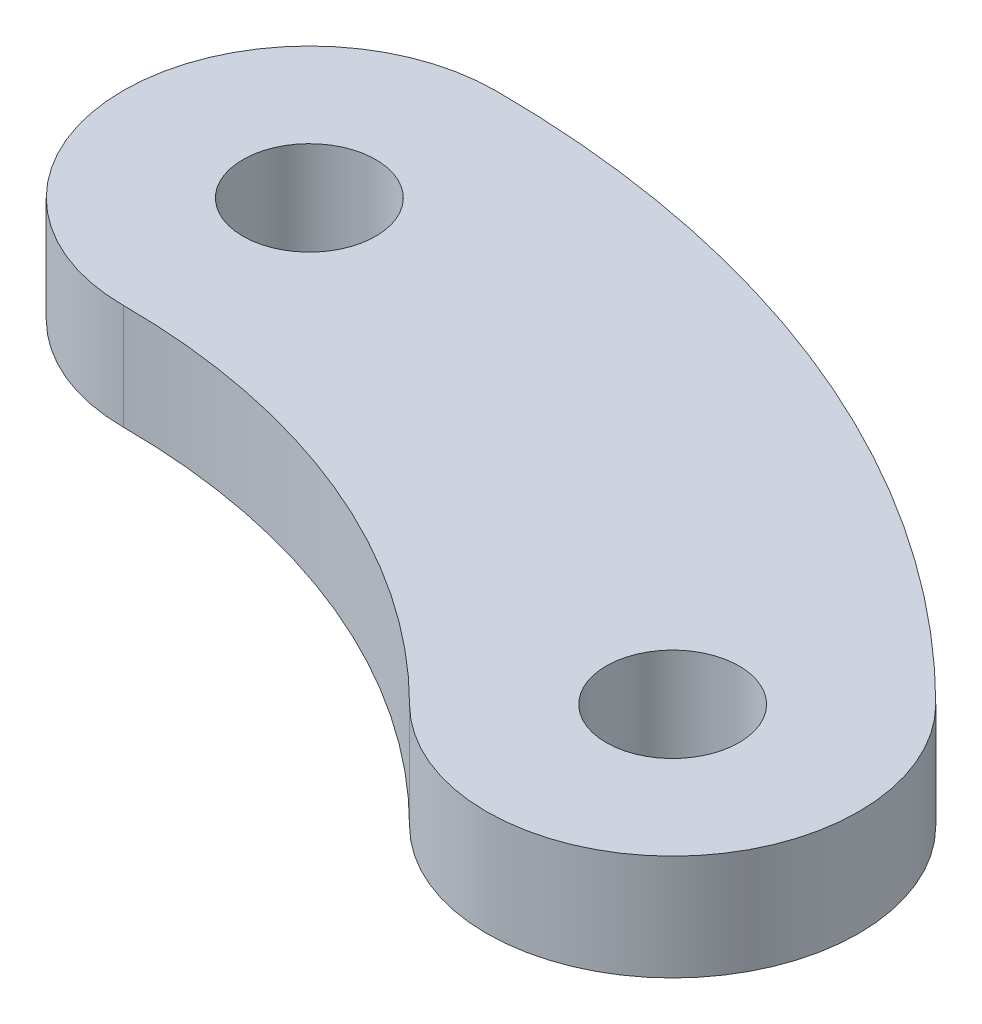
ISO-10303-21;
HEADER;
FILE_DESCRIPTION(('STEP AP214'),'2;1');
FILE_NAME('part.step','',(''),(''),'','','');
FILE_SCHEMA(('AUTOMOTIVE_DESIGN { 1 0 10303 214 1 1 1 1 }'));
ENDSEC;
DATA;
#1=APPLICATION_CONTEXT('core data for automotive mechanical design processes');
#2=APPLICATION_PROTOCOL_DEFINITION('international standard','automotive_design',2000,#1);
#3=PRODUCT_CONTEXT('',#1,'mechanical');
#4=PRODUCT('Part','Part','',(#3));
#5=PRODUCT_RELATED_PRODUCT_CATEGORY('part','',(#4));
#6=PRODUCT_DEFINITION_FORMATION('','',#4);
#7=PRODUCT_DEFINITION_CONTEXT('part definition',#1,'design');
#8=PRODUCT_DEFINITION('design','',#6,#7);
#9=PRODUCT_DEFINITION_SHAPE('','',#8);
#10=(LENGTH_UNIT() NAMED_UNIT(*) SI_UNIT(.MILLI.,.METRE.));
#11=(NAMED_UNIT(*) PLANE_ANGLE_UNIT() SI_UNIT($,.RADIAN.));
#12=(NAMED_UNIT(*) SI_UNIT($,.STERADIAN.) SOLID_ANGLE_UNIT());
#13=UNCERTAINTY_MEASURE_WITH_UNIT(LENGTH_MEASURE(1.E-05),#10,'distance_accuracy_value','');
#14=(GEOMETRIC_REPRESENTATION_CONTEXT(3) GLOBAL_UNCERTAINTY_ASSIGNED_CONTEXT((#13)) GLOBAL_UNIT_ASSIGNED_CONTEXT((#10,
#11,#12)) REPRESENTATION_CONTEXT('',''));
#15=CARTESIAN_POINT('',(0.,0.,0.));
#16=DIRECTION('',(0.,0.,1.));
#17=DIRECTION('',(1.,0.,0.));
#18=AXIS2_PLACEMENT_3D('',#15,#16,#17);
#19=CARTESIAN_POINT('',(23.3345237791559,7.9375,-23.3345237791562));
#20=DIRECTION('',(0.,1.,0.));
#21=DIRECTION('',(0.,0.,1.));
#22=AXIS2_PLACEMENT_3D('',#19,#20,#21);
#23=PLANE('',#22);
#24=CARTESIAN_POINT('',(0.,7.9375,-66.));
#25=DIRECTION('',(0.,1.,0.));
#26=DIRECTION('',(0.,0.,1.));
#27=AXIS2_PLACEMENT_3D('',#24,#25,#26);
#28=CIRCLE('',#27,5.);
#29=CARTESIAN_POINT('',(0.,7.9375,-61.));
#30=VERTEX_POINT('',#29);
#31=EDGE_CURVE('E100',#30,#30,#28,.T.);
#32=ORIENTED_EDGE('',*,*,#31,.F.);
#33=EDGE_LOOP('',(#32));
#34=FACE_BOUND('',#33,.T.);
#35=CARTESIAN_POINT('',(46.6690475583119,7.9375,-46.6690475583124));
#36=DIRECTION('',(0.,1.,0.));
#37=DIRECTION('',(0.,0.,1.));
#38=AXIS2_PLACEMENT_3D('',#35,#36,#37);
#39=CIRCLE('',#38,14.);
#40=CARTESIAN_POINT('',(36.7695526217003,7.9375,-36.7695526217007));
#41=VERTEX_POINT('',#40);
#42=CARTESIAN_POINT('',(56.5685424949235,7.9375,-56.5685424949241));
#43=VERTEX_POINT('',#42);
#44=EDGE_CURVE('E85',#41,#43,#39,.T.);
#45=ORIENTED_EDGE('',*,*,#44,.T.);
#46=CARTESIAN_POINT('',(0.,7.9375,0.));
#47=DIRECTION('',(0.,1.,0.));
#48=DIRECTION('',(0.,0.,1.));
#49=AXIS2_PLACEMENT_3D('',#46,#47,#48);
#50=CIRCLE('',#49,80.);
#51=CARTESIAN_POINT('',(0.,7.9375,-80.));
#52=VERTEX_POINT('',#51);
#53=EDGE_CURVE('E80',#43,#52,#50,.T.);
#54=ORIENTED_EDGE('',*,*,#53,.T.);
#55=CARTESIAN_POINT('',(0.,7.9375,-66.));
#56=DIRECTION('',(0.,1.,0.));
#57=DIRECTION('',(0.,0.,1.));
#58=AXIS2_PLACEMENT_3D('',#55,#56,#57);
#59=CIRCLE('',#58,14.);
#60=CARTESIAN_POINT('',(0.,7.9375,-52.));
#61=VERTEX_POINT('',#60);
#62=EDGE_CURVE('E83',#52,#61,#59,.T.);
#63=ORIENTED_EDGE('',*,*,#62,.T.);
#64=CARTESIAN_POINT('',(0.,7.9375,0.));
#65=DIRECTION('',(0.,-1.,0.));
#66=DIRECTION('',(0.,0.,1.));
#67=AXIS2_PLACEMENT_3D('',#64,#65,#66);
#68=CIRCLE('',#67,52.);
#69=EDGE_CURVE('E50',#61,#41,#68,.T.);
#70=ORIENTED_EDGE('',*,*,#69,.T.);
#71=EDGE_LOOP('',(#45,#54,#63,#70));
#72=FACE_BOUND('',#71,.T.);
#73=CARTESIAN_POINT('',(46.6690475583119,7.9375,-46.6690475583124));
#74=DIRECTION('',(0.,1.,0.));
#75=DIRECTION('',(0.,0.,1.));
#76=AXIS2_PLACEMENT_3D('',#73,#74,#75);
#77=CIRCLE('',#76,4.99999999999999);
#78=CARTESIAN_POINT('',(46.6690475583119,7.9375,-41.6690475583124));
#79=VERTEX_POINT('',#78);
#80=EDGE_CURVE('E115',#79,#79,#77,.T.);
#81=ORIENTED_EDGE('',*,*,#80,.F.);
#82=EDGE_LOOP('',(#81));
#83=FACE_BOUND('',#82,.T.);
#84=ADVANCED_FACE('F33',(#34,#72,#83),#23,.T.);
#85=CARTESIAN_POINT('',(23.3345237791559,0.,-23.3345237791562));
#86=DIRECTION('',(0.,1.,0.));
#87=DIRECTION('',(0.,0.,1.));
#88=AXIS2_PLACEMENT_3D('',#85,#86,#87);
#89=PLANE('',#88);
#90=CARTESIAN_POINT('',(46.6690475583119,0.,-46.6690475583124));
#91=DIRECTION('',(0.,1.,0.));
#92=DIRECTION('',(0.,0.,1.));
#93=AXIS2_PLACEMENT_3D('',#90,#91,#92);
#94=CIRCLE('',#93,14.);
#95=CARTESIAN_POINT('',(36.7695526217003,0.,-36.7695526217007));
#96=VERTEX_POINT('',#95);
#97=CARTESIAN_POINT('',(56.5685424949235,0.,-56.5685424949241));
#98=VERTEX_POINT('',#97);
#99=EDGE_CURVE('E97',#96,#98,#94,.T.);
#100=ORIENTED_EDGE('',*,*,#99,.F.);
#101=CARTESIAN_POINT('',(0.,0.,0.));
#102=DIRECTION('',(0.,-1.,0.));
#103=DIRECTION('',(0.,0.,1.));
#104=AXIS2_PLACEMENT_3D('',#101,#102,#103);
#105=CIRCLE('',#104,52.);
#106=CARTESIAN_POINT('',(0.,0.,-52.));
#107=VERTEX_POINT('',#106);
#108=EDGE_CURVE('E73',#107,#96,#105,.T.);
#109=ORIENTED_EDGE('',*,*,#108,.F.);
#110=CARTESIAN_POINT('',(0.,0.,-66.));
#111=DIRECTION('',(0.,1.,0.));
#112=DIRECTION('',(0.,0.,1.));
#113=AXIS2_PLACEMENT_3D('',#110,#111,#112);
#114=CIRCLE('',#113,14.);
#115=CARTESIAN_POINT('',(0.,0.,-80.));
#116=VERTEX_POINT('',#115);
#117=EDGE_CURVE('E67',#116,#107,#114,.T.);
#118=ORIENTED_EDGE('',*,*,#117,.F.);
#119=CARTESIAN_POINT('',(0.,0.,0.));
#120=DIRECTION('',(0.,1.,0.));
#121=DIRECTION('',(0.,0.,1.));
#122=AXIS2_PLACEMENT_3D('',#119,#120,#121);
#123=CIRCLE('',#122,80.);
#124=EDGE_CURVE('E89',#98,#116,#123,.T.);
#125=ORIENTED_EDGE('',*,*,#124,.F.);
#126=EDGE_LOOP('',(#100,#109,#118,#125));
#127=FACE_BOUND('',#126,.T.);
#128=CARTESIAN_POINT('',(0.,0.,-66.));
#129=DIRECTION('',(0.,1.,0.));
#130=DIRECTION('',(0.,0.,1.));
#131=AXIS2_PLACEMENT_3D('',#128,#129,#130);
#132=CIRCLE('',#131,5.);
#133=CARTESIAN_POINT('',(0.,0.,-61.));
#134=VERTEX_POINT('',#133);
#135=EDGE_CURVE('E112',#134,#134,#132,.T.);
#136=ORIENTED_EDGE('',*,*,#135,.T.);
#137=EDGE_LOOP('',(#136));
#138=FACE_BOUND('',#137,.T.);
#139=CARTESIAN_POINT('',(46.6690475583119,0.,-46.6690475583124));
#140=DIRECTION('',(0.,1.,0.));
#141=DIRECTION('',(0.,0.,1.));
#142=AXIS2_PLACEMENT_3D('',#139,#140,#141);
#143=CIRCLE('',#142,4.99999999999999);
#144=CARTESIAN_POINT('',(46.6690475583119,0.,-41.6690475583124));
#145=VERTEX_POINT('',#144);
#146=EDGE_CURVE('E118',#145,#145,#143,.T.);
#147=ORIENTED_EDGE('',*,*,#146,.T.);
#148=EDGE_LOOP('',(#147));
#149=FACE_BOUND('',#148,.T.);
#150=ADVANCED_FACE('F108',(#127,#138,#149),#89,.F.);
#151=CARTESIAN_POINT('',(46.6690475583119,7.9375,-46.6690475583124));
#152=DIRECTION('',(0.,-1.,0.));
#153=DIRECTION('',(0.,0.,-1.));
#154=AXIS2_PLACEMENT_3D('',#151,#152,#153);
#155=CYLINDRICAL_SURFACE('',#154,14.);
#156=ORIENTED_EDGE('',*,*,#99,.T.);
#157=DIRECTION('',(0.,-1.,0.));
#158=VECTOR('',#157,1.);
#159=CARTESIAN_POINT('',(56.5685424949235,7.9375,-56.5685424949241));
#160=LINE('',#159,#158);
#161=EDGE_CURVE('E11',#43,#98,#160,.T.);
#162=ORIENTED_EDGE('',*,*,#161,.F.);
#163=ORIENTED_EDGE('',*,*,#44,.F.);
#164=DIRECTION('',(0.,-1.,0.));
#165=VECTOR('',#164,1.);
#166=CARTESIAN_POINT('',(36.7695526217003,7.9375,-36.7695526217007));
#167=LINE('',#166,#165);
#168=EDGE_CURVE('E93',#41,#96,#167,.T.);
#169=ORIENTED_EDGE('',*,*,#168,.T.);
#170=EDGE_LOOP('',(#156,#162,#163,#169));
#171=FACE_BOUND('',#170,.T.);
#172=ADVANCED_FACE('F35',(#171),#155,.T.);
#173=CARTESIAN_POINT('',(0.,7.9375,0.));
#174=DIRECTION('',(0.,-1.,0.));
#175=DIRECTION('',(0.,0.,-1.));
#176=AXIS2_PLACEMENT_3D('',#173,#174,#175);
#177=CYLINDRICAL_SURFACE('',#176,80.);
#178=ORIENTED_EDGE('',*,*,#124,.T.);
#179=DIRECTION('',(0.,-1.,0.));
#180=VECTOR('',#179,1.);
#181=CARTESIAN_POINT('',(0.,7.9375,-80.));
#182=LINE('',#181,#180);
#183=EDGE_CURVE('E42',#52,#116,#182,.T.);
#184=ORIENTED_EDGE('',*,*,#183,.F.);
#185=ORIENTED_EDGE('',*,*,#53,.F.);
#186=ORIENTED_EDGE('',*,*,#161,.T.);
#187=EDGE_LOOP('',(#178,#184,#185,#186));
#188=FACE_BOUND('',#187,.T.);
#189=ADVANCED_FACE('F88',(#188),#177,.T.);
#190=CARTESIAN_POINT('',(0.,7.9375,-66.));
#191=DIRECTION('',(0.,-1.,0.));
#192=DIRECTION('',(0.,0.,-1.));
#193=AXIS2_PLACEMENT_3D('',#190,#191,#192);
#194=CYLINDRICAL_SURFACE('',#193,14.);
#195=ORIENTED_EDGE('',*,*,#117,.T.);
#196=DIRECTION('',(0.,-1.,0.));
#197=VECTOR('',#196,1.);
#198=CARTESIAN_POINT('',(0.,7.9375,-52.));
#199=LINE('',#198,#197);
#200=EDGE_CURVE('E90',#61,#107,#199,.T.);
#201=ORIENTED_EDGE('',*,*,#200,.F.);
#202=ORIENTED_EDGE('',*,*,#62,.F.);
#203=ORIENTED_EDGE('',*,*,#183,.T.);
#204=EDGE_LOOP('',(#195,#201,#202,#203));
#205=FACE_BOUND('',#204,.T.);
#206=ADVANCED_FACE('F91',(#205),#194,.T.);
#207=CARTESIAN_POINT('',(0.,7.9375,0.));
#208=DIRECTION('',(0.,-1.,0.));
#209=DIRECTION('',(0.,0.,-1.));
#210=AXIS2_PLACEMENT_3D('',#207,#208,#209);
#211=CYLINDRICAL_SURFACE('',#210,52.);
#212=ORIENTED_EDGE('',*,*,#108,.T.);
#213=ORIENTED_EDGE('',*,*,#168,.F.);
#214=ORIENTED_EDGE('',*,*,#69,.F.);
#215=ORIENTED_EDGE('',*,*,#200,.T.);
#216=EDGE_LOOP('',(#212,#213,#214,#215));
#217=FACE_BOUND('',#216,.T.);
#218=ADVANCED_FACE('F105',(#217),#211,.F.);
#219=CARTESIAN_POINT('',(0.,7.9375,-66.));
#220=DIRECTION('',(0.,-1.,0.));
#221=DIRECTION('',(0.,0.,-1.));
#222=AXIS2_PLACEMENT_3D('',#219,#220,#221);
#223=CYLINDRICAL_SURFACE('',#222,5.);
#224=ORIENTED_EDGE('',*,*,#31,.T.);
#225=EDGE_LOOP('',(#224));
#226=FACE_BOUND('',#225,.T.);
#227=ORIENTED_EDGE('',*,*,#135,.F.);
#228=EDGE_LOOP('',(#227));
#229=FACE_BOUND('',#228,.T.);
#230=ADVANCED_FACE('F135',(#226,#229),#223,.F.);
#231=CARTESIAN_POINT('',(46.6690475583119,7.9375,-46.6690475583124));
#232=DIRECTION('',(0.,-1.,0.));
#233=DIRECTION('',(0.,0.,-1.));
#234=AXIS2_PLACEMENT_3D('',#231,#232,#233);
#235=CYLINDRICAL_SURFACE('',#234,4.99999999999999);
#236=ORIENTED_EDGE('',*,*,#80,.T.);
#237=EDGE_LOOP('',(#236));
#238=FACE_BOUND('',#237,.T.);
#239=ORIENTED_EDGE('',*,*,#146,.F.);
#240=EDGE_LOOP('',(#239));
#241=FACE_BOUND('',#240,.T.);
#242=ADVANCED_FACE('F124',(#238,#241),#235,.F.);
#243=CLOSED_SHELL('',(#84,#150,#172,#189,#206,#218,#230,#242));
#244=MANIFOLD_SOLID_BREP('B2',#243);
#245=ADVANCED_BREP_SHAPE_REPRESENTATION('',(#18,#244),#14);
#246=SHAPE_DEFINITION_REPRESENTATION(#9,#245);
ENDSEC;
END-ISO-10303-21;
